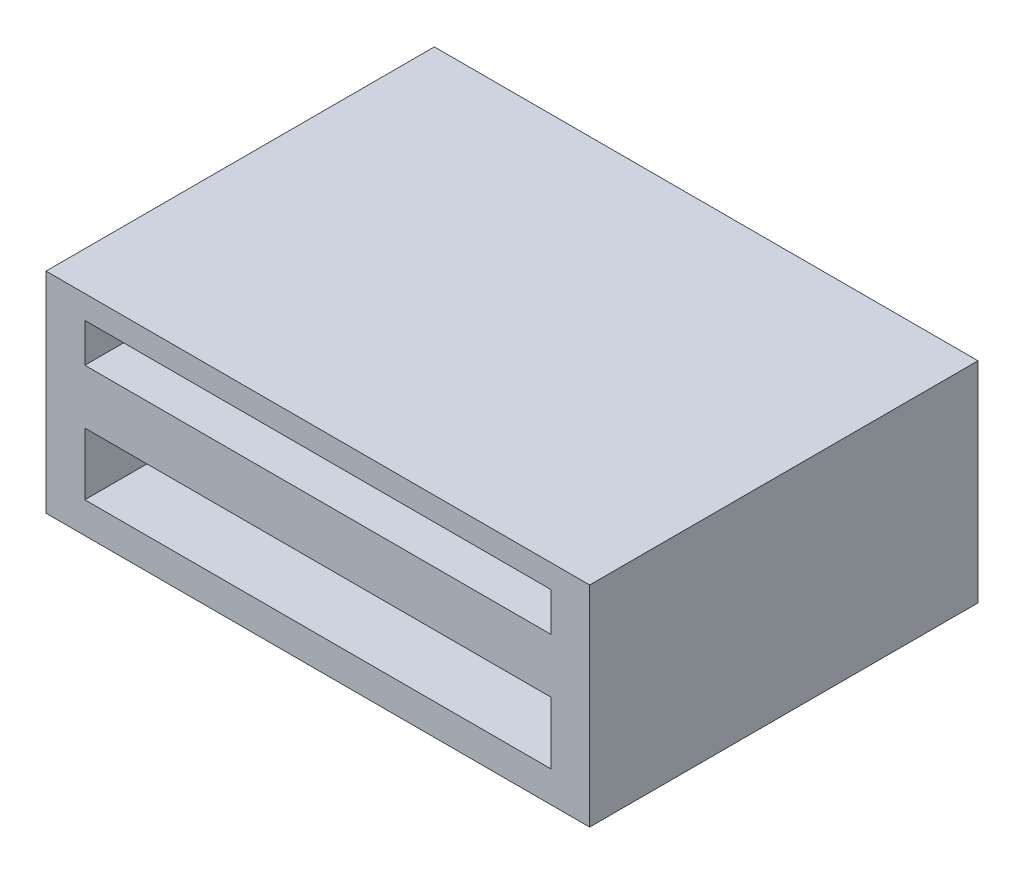
ISO-10303-21;
HEADER;
FILE_DESCRIPTION(('STEP AP214'),'2;1');
FILE_NAME('part.step','',(''),(''),'','','');
FILE_SCHEMA(('AUTOMOTIVE_DESIGN { 1 0 10303 214 1 1 1 1 }'));
ENDSEC;
DATA;
#1=APPLICATION_CONTEXT('core data for automotive mechanical design processes');
#2=APPLICATION_PROTOCOL_DEFINITION('international standard','automotive_design',2000,#1);
#3=PRODUCT_CONTEXT('',#1,'mechanical');
#4=PRODUCT('Part','Part','',(#3));
#5=PRODUCT_RELATED_PRODUCT_CATEGORY('part','',(#4));
#6=PRODUCT_DEFINITION_FORMATION('','',#4);
#7=PRODUCT_DEFINITION_CONTEXT('part definition',#1,'design');
#8=PRODUCT_DEFINITION('design','',#6,#7);
#9=PRODUCT_DEFINITION_SHAPE('','',#8);
#10=(LENGTH_UNIT() NAMED_UNIT(*) SI_UNIT(.MILLI.,.METRE.));
#11=(NAMED_UNIT(*) PLANE_ANGLE_UNIT() SI_UNIT($,.RADIAN.));
#12=(NAMED_UNIT(*) SI_UNIT($,.STERADIAN.) SOLID_ANGLE_UNIT());
#13=UNCERTAINTY_MEASURE_WITH_UNIT(LENGTH_MEASURE(1.E-05),#10,'distance_accuracy_value','');
#14=(GEOMETRIC_REPRESENTATION_CONTEXT(3) GLOBAL_UNCERTAINTY_ASSIGNED_CONTEXT((#13)) GLOBAL_UNIT_ASSIGNED_CONTEXT((#10,
#11,#12)) REPRESENTATION_CONTEXT('',''));
#15=CARTESIAN_POINT('',(0.,0.,0.));
#16=DIRECTION('',(0.,0.,1.));
#17=DIRECTION('',(1.,0.,0.));
#18=AXIS2_PLACEMENT_3D('',#15,#16,#17);
#19=CARTESIAN_POINT('',(0.,0.,50.));
#20=DIRECTION('',(0.,0.,-1.));
#21=DIRECTION('',(-1.,0.,0.));
#22=AXIS2_PLACEMENT_3D('',#19,#20,#21);
#23=PLANE('',#22);
#24=DIRECTION('',(0.,-1.,0.));
#25=VECTOR('',#24,1.);
#26=CARTESIAN_POINT('',(5.,4.,50.));
#27=LINE('',#26,#25);
#28=CARTESIAN_POINT('',(5.,12.,50.));
#29=VERTEX_POINT('',#28);
#30=CARTESIAN_POINT('',(5.,4.,50.));
#31=VERTEX_POINT('',#30);
#32=EDGE_CURVE('E162',#29,#31,#27,.T.);
#33=ORIENTED_EDGE('',*,*,#32,.F.);
#34=DIRECTION('',(-1.,0.,0.));
#35=VECTOR('',#34,1.);
#36=CARTESIAN_POINT('',(5.,12.,50.));
#37=LINE('',#36,#35);
#38=CARTESIAN_POINT('',(65.,12.,50.));
#39=VERTEX_POINT('',#38);
#40=EDGE_CURVE('E170',#39,#29,#37,.T.);
#41=ORIENTED_EDGE('',*,*,#40,.F.);
#42=DIRECTION('',(0.,1.,0.));
#43=VECTOR('',#42,1.);
#44=CARTESIAN_POINT('',(65.,4.,50.));
#45=LINE('',#44,#43);
#46=CARTESIAN_POINT('',(65.,4.,50.));
#47=VERTEX_POINT('',#46);
#48=EDGE_CURVE('E167',#47,#39,#45,.T.);
#49=ORIENTED_EDGE('',*,*,#48,.F.);
#50=DIRECTION('',(1.,0.,0.));
#51=VECTOR('',#50,1.);
#52=CARTESIAN_POINT('',(5.,4.,50.));
#53=LINE('',#52,#51);
#54=EDGE_CURVE('E164',#31,#47,#53,.T.);
#55=ORIENTED_EDGE('',*,*,#54,.F.);
#56=EDGE_LOOP('',(#33,#41,#49,#55));
#57=FACE_BOUND('',#56,.T.);
#58=DIRECTION('',(0.,-1.,0.));
#59=VECTOR('',#58,1.);
#60=CARTESIAN_POINT('',(0.,0.,50.));
#61=LINE('',#60,#59);
#62=CARTESIAN_POINT('',(0.,27.,50.));
#63=VERTEX_POINT('',#62);
#64=CARTESIAN_POINT('',(0.,0.,50.));
#65=VERTEX_POINT('',#64);
#66=EDGE_CURVE('E193',#63,#65,#61,.T.);
#67=ORIENTED_EDGE('',*,*,#66,.T.);
#68=DIRECTION('',(1.,0.,0.));
#69=VECTOR('',#68,1.);
#70=CARTESIAN_POINT('',(0.,0.,50.));
#71=LINE('',#70,#69);
#72=CARTESIAN_POINT('',(70.,0.,50.));
#73=VERTEX_POINT('',#72);
#74=EDGE_CURVE('E196',#65,#73,#71,.T.);
#75=ORIENTED_EDGE('',*,*,#74,.T.);
#76=DIRECTION('',(0.,1.,0.));
#77=VECTOR('',#76,1.);
#78=CARTESIAN_POINT('',(70.,0.,50.));
#79=LINE('',#78,#77);
#80=CARTESIAN_POINT('',(70.,27.,50.));
#81=VERTEX_POINT('',#80);
#82=EDGE_CURVE('E199',#73,#81,#79,.T.);
#83=ORIENTED_EDGE('',*,*,#82,.T.);
#84=DIRECTION('',(-1.,0.,0.));
#85=VECTOR('',#84,1.);
#86=CARTESIAN_POINT('',(0.,27.,50.));
#87=LINE('',#86,#85);
#88=EDGE_CURVE('E201',#81,#63,#87,.T.);
#89=ORIENTED_EDGE('',*,*,#88,.T.);
#90=EDGE_LOOP('',(#67,#75,#83,#89));
#91=FACE_BOUND('',#90,.T.);
#92=DIRECTION('',(0.,-1.,0.));
#93=VECTOR('',#92,1.);
#94=CARTESIAN_POINT('',(5.,19.,50.));
#95=LINE('',#94,#93);
#96=CARTESIAN_POINT('',(5.,24.,50.));
#97=VERTEX_POINT('',#96);
#98=CARTESIAN_POINT('',(5.,19.,50.));
#99=VERTEX_POINT('',#98);
#100=EDGE_CURVE('E126',#97,#99,#95,.T.);
#101=ORIENTED_EDGE('',*,*,#100,.F.);
#102=DIRECTION('',(-1.,0.,0.));
#103=VECTOR('',#102,1.);
#104=CARTESIAN_POINT('',(5.,24.,50.));
#105=LINE('',#104,#103);
#106=CARTESIAN_POINT('',(65.,24.,50.));
#107=VERTEX_POINT('',#106);
#108=EDGE_CURVE('E148',#107,#97,#105,.T.);
#109=ORIENTED_EDGE('',*,*,#108,.F.);
#110=DIRECTION('',(0.,1.,0.));
#111=VECTOR('',#110,1.);
#112=CARTESIAN_POINT('',(65.,19.,50.));
#113=LINE('',#112,#111);
#114=CARTESIAN_POINT('',(65.,19.,50.));
#115=VERTEX_POINT('',#114);
#116=EDGE_CURVE('E146',#115,#107,#113,.T.);
#117=ORIENTED_EDGE('',*,*,#116,.F.);
#118=DIRECTION('',(1.,0.,0.));
#119=VECTOR('',#118,1.);
#120=CARTESIAN_POINT('',(5.,19.,50.));
#121=LINE('',#120,#119);
#122=EDGE_CURVE('E134',#99,#115,#121,.T.);
#123=ORIENTED_EDGE('',*,*,#122,.F.);
#124=EDGE_LOOP('',(#101,#109,#117,#123));
#125=FACE_BOUND('',#124,.T.);
#126=ADVANCED_FACE('F37',(#57,#91,#125),#23,.F.);
#127=CARTESIAN_POINT('',(0.,0.,0.));
#128=DIRECTION('',(0.,0.,-1.));
#129=DIRECTION('',(-1.,0.,0.));
#130=AXIS2_PLACEMENT_3D('',#127,#128,#129);
#131=PLANE('',#130);
#132=DIRECTION('',(-1.,0.,0.));
#133=VECTOR('',#132,1.);
#134=CARTESIAN_POINT('',(5.,12.,0.));
#135=LINE('',#134,#133);
#136=CARTESIAN_POINT('',(65.,12.,0.));
#137=VERTEX_POINT('',#136);
#138=CARTESIAN_POINT('',(5.,12.,0.));
#139=VERTEX_POINT('',#138);
#140=EDGE_CURVE('E165',#137,#139,#135,.T.);
#141=ORIENTED_EDGE('',*,*,#140,.T.);
#142=DIRECTION('',(0.,-1.,0.));
#143=VECTOR('',#142,1.);
#144=CARTESIAN_POINT('',(5.,4.,0.));
#145=LINE('',#144,#143);
#146=CARTESIAN_POINT('',(5.,4.,0.));
#147=VERTEX_POINT('',#146);
#148=EDGE_CURVE('E142',#139,#147,#145,.T.);
#149=ORIENTED_EDGE('',*,*,#148,.T.);
#150=DIRECTION('',(1.,0.,0.));
#151=VECTOR('',#150,1.);
#152=CARTESIAN_POINT('',(5.,4.,0.));
#153=LINE('',#152,#151);
#154=CARTESIAN_POINT('',(65.,4.,0.));
#155=VERTEX_POINT('',#154);
#156=EDGE_CURVE('E175',#147,#155,#153,.T.);
#157=ORIENTED_EDGE('',*,*,#156,.T.);
#158=DIRECTION('',(0.,1.,0.));
#159=VECTOR('',#158,1.);
#160=CARTESIAN_POINT('',(65.,4.,0.));
#161=LINE('',#160,#159);
#162=EDGE_CURVE('E178',#155,#137,#161,.T.);
#163=ORIENTED_EDGE('',*,*,#162,.T.);
#164=EDGE_LOOP('',(#141,#149,#157,#163));
#165=FACE_BOUND('',#164,.T.);
#166=DIRECTION('',(0.,-1.,0.));
#167=VECTOR('',#166,1.);
#168=CARTESIAN_POINT('',(0.,0.,0.));
#169=LINE('',#168,#167);
#170=CARTESIAN_POINT('',(0.,27.,0.));
#171=VERTEX_POINT('',#170);
#172=CARTESIAN_POINT('',(0.,0.,0.));
#173=VERTEX_POINT('',#172);
#174=EDGE_CURVE('E192',#171,#173,#169,.T.);
#175=ORIENTED_EDGE('',*,*,#174,.F.);
#176=DIRECTION('',(-1.,0.,0.));
#177=VECTOR('',#176,1.);
#178=CARTESIAN_POINT('',(0.,27.,0.));
#179=LINE('',#178,#177);
#180=CARTESIAN_POINT('',(70.,27.,0.));
#181=VERTEX_POINT('',#180);
#182=EDGE_CURVE('E197',#181,#171,#179,.T.);
#183=ORIENTED_EDGE('',*,*,#182,.F.);
#184=DIRECTION('',(0.,1.,0.));
#185=VECTOR('',#184,1.);
#186=CARTESIAN_POINT('',(70.,0.,0.));
#187=LINE('',#186,#185);
#188=CARTESIAN_POINT('',(70.,0.,0.));
#189=VERTEX_POINT('',#188);
#190=EDGE_CURVE('E208',#189,#181,#187,.T.);
#191=ORIENTED_EDGE('',*,*,#190,.F.);
#192=DIRECTION('',(1.,0.,0.));
#193=VECTOR('',#192,1.);
#194=CARTESIAN_POINT('',(0.,0.,0.));
#195=LINE('',#194,#193);
#196=EDGE_CURVE('E206',#173,#189,#195,.T.);
#197=ORIENTED_EDGE('',*,*,#196,.F.);
#198=EDGE_LOOP('',(#175,#183,#191,#197));
#199=FACE_BOUND('',#198,.T.);
#200=DIRECTION('',(-1.,0.,0.));
#201=VECTOR('',#200,1.);
#202=CARTESIAN_POINT('',(5.,24.,0.));
#203=LINE('',#202,#201);
#204=CARTESIAN_POINT('',(65.,24.,0.));
#205=VERTEX_POINT('',#204);
#206=CARTESIAN_POINT('',(5.,24.,0.));
#207=VERTEX_POINT('',#206);
#208=EDGE_CURVE('E135',#205,#207,#203,.T.);
#209=ORIENTED_EDGE('',*,*,#208,.T.);
#210=DIRECTION('',(0.,-1.,0.));
#211=VECTOR('',#210,1.);
#212=CARTESIAN_POINT('',(5.,19.,0.));
#213=LINE('',#212,#211);
#214=CARTESIAN_POINT('',(5.,19.,0.));
#215=VERTEX_POINT('',#214);
#216=EDGE_CURVE('E60',#207,#215,#213,.T.);
#217=ORIENTED_EDGE('',*,*,#216,.T.);
#218=DIRECTION('',(1.,0.,0.));
#219=VECTOR('',#218,1.);
#220=CARTESIAN_POINT('',(5.,19.,0.));
#221=LINE('',#220,#219);
#222=CARTESIAN_POINT('',(65.,19.,0.));
#223=VERTEX_POINT('',#222);
#224=EDGE_CURVE('E141',#215,#223,#221,.T.);
#225=ORIENTED_EDGE('',*,*,#224,.T.);
#226=DIRECTION('',(0.,1.,0.));
#227=VECTOR('',#226,1.);
#228=CARTESIAN_POINT('',(65.,19.,0.));
#229=LINE('',#228,#227);
#230=EDGE_CURVE('E154',#223,#205,#229,.T.);
#231=ORIENTED_EDGE('',*,*,#230,.T.);
#232=EDGE_LOOP('',(#209,#217,#225,#231));
#233=FACE_BOUND('',#232,.T.);
#234=ADVANCED_FACE('F226',(#165,#199,#233),#131,.T.);
#235=CARTESIAN_POINT('',(0.,0.,50.));
#236=DIRECTION('',(1.,0.,0.));
#237=DIRECTION('',(0.,0.,-1.));
#238=AXIS2_PLACEMENT_3D('',#235,#236,#237);
#239=PLANE('',#238);
#240=ORIENTED_EDGE('',*,*,#174,.T.);
#241=DIRECTION('',(0.,0.,-1.));
#242=VECTOR('',#241,1.);
#243=CARTESIAN_POINT('',(0.,0.,50.));
#244=LINE('',#243,#242);
#245=EDGE_CURVE('E11',#65,#173,#244,.T.);
#246=ORIENTED_EDGE('',*,*,#245,.F.);
#247=ORIENTED_EDGE('',*,*,#66,.F.);
#248=DIRECTION('',(0.,0.,-1.));
#249=VECTOR('',#248,1.);
#250=CARTESIAN_POINT('',(0.,27.,50.));
#251=LINE('',#250,#249);
#252=EDGE_CURVE('E203',#63,#171,#251,.T.);
#253=ORIENTED_EDGE('',*,*,#252,.T.);
#254=EDGE_LOOP('',(#240,#246,#247,#253));
#255=FACE_BOUND('',#254,.T.);
#256=ADVANCED_FACE('F39',(#255),#239,.F.);
#257=CARTESIAN_POINT('',(0.,0.,50.));
#258=DIRECTION('',(0.,1.,0.));
#259=DIRECTION('',(0.,0.,1.));
#260=AXIS2_PLACEMENT_3D('',#257,#258,#259);
#261=PLANE('',#260);
#262=ORIENTED_EDGE('',*,*,#196,.T.);
#263=DIRECTION('',(0.,0.,-1.));
#264=VECTOR('',#263,1.);
#265=CARTESIAN_POINT('',(70.,0.,50.));
#266=LINE('',#265,#264);
#267=EDGE_CURVE('E45',#73,#189,#266,.T.);
#268=ORIENTED_EDGE('',*,*,#267,.F.);
#269=ORIENTED_EDGE('',*,*,#74,.F.);
#270=ORIENTED_EDGE('',*,*,#245,.T.);
#271=EDGE_LOOP('',(#262,#268,#269,#270));
#272=FACE_BOUND('',#271,.T.);
#273=ADVANCED_FACE('F236',(#272),#261,.F.);
#274=CARTESIAN_POINT('',(70.,0.,50.));
#275=DIRECTION('',(-1.,0.,0.));
#276=DIRECTION('',(0.,0.,1.));
#277=AXIS2_PLACEMENT_3D('',#274,#275,#276);
#278=PLANE('',#277);
#279=ORIENTED_EDGE('',*,*,#190,.T.);
#280=DIRECTION('',(0.,0.,-1.));
#281=VECTOR('',#280,1.);
#282=CARTESIAN_POINT('',(70.,27.,50.));
#283=LINE('',#282,#281);
#284=EDGE_CURVE('E213',#81,#181,#283,.T.);
#285=ORIENTED_EDGE('',*,*,#284,.F.);
#286=ORIENTED_EDGE('',*,*,#82,.F.);
#287=ORIENTED_EDGE('',*,*,#267,.T.);
#288=EDGE_LOOP('',(#279,#285,#286,#287));
#289=FACE_BOUND('',#288,.T.);
#290=ADVANCED_FACE('F220',(#289),#278,.F.);
#291=CARTESIAN_POINT('',(0.,27.,50.));
#292=DIRECTION('',(0.,-1.,0.));
#293=DIRECTION('',(0.,0.,-1.));
#294=AXIS2_PLACEMENT_3D('',#291,#292,#293);
#295=PLANE('',#294);
#296=ORIENTED_EDGE('',*,*,#182,.T.);
#297=ORIENTED_EDGE('',*,*,#252,.F.);
#298=ORIENTED_EDGE('',*,*,#88,.F.);
#299=ORIENTED_EDGE('',*,*,#284,.T.);
#300=EDGE_LOOP('',(#296,#297,#298,#299));
#301=FACE_BOUND('',#300,.T.);
#302=ADVANCED_FACE('F230',(#301),#295,.F.);
#303=CARTESIAN_POINT('',(5.,4.,50.));
#304=DIRECTION('',(1.,0.,0.));
#305=DIRECTION('',(0.,0.,-1.));
#306=AXIS2_PLACEMENT_3D('',#303,#304,#305);
#307=PLANE('',#306);
#308=ORIENTED_EDGE('',*,*,#148,.F.);
#309=DIRECTION('',(0.,0.,-1.));
#310=VECTOR('',#309,1.);
#311=CARTESIAN_POINT('',(5.,12.,50.));
#312=LINE('',#311,#310);
#313=EDGE_CURVE('E172',#29,#139,#312,.T.);
#314=ORIENTED_EDGE('',*,*,#313,.F.);
#315=ORIENTED_EDGE('',*,*,#32,.T.);
#316=DIRECTION('',(0.,0.,-1.));
#317=VECTOR('',#316,1.);
#318=CARTESIAN_POINT('',(5.,4.,50.));
#319=LINE('',#318,#317);
#320=EDGE_CURVE('E189',#31,#147,#319,.T.);
#321=ORIENTED_EDGE('',*,*,#320,.T.);
#322=EDGE_LOOP('',(#308,#314,#315,#321));
#323=FACE_BOUND('',#322,.T.);
#324=ADVANCED_FACE('F253',(#323),#307,.T.);
#325=CARTESIAN_POINT('',(5.,4.,50.));
#326=DIRECTION('',(0.,1.,0.));
#327=DIRECTION('',(0.,0.,1.));
#328=AXIS2_PLACEMENT_3D('',#325,#326,#327);
#329=PLANE('',#328);
#330=ORIENTED_EDGE('',*,*,#156,.F.);
#331=ORIENTED_EDGE('',*,*,#320,.F.);
#332=ORIENTED_EDGE('',*,*,#54,.T.);
#333=DIRECTION('',(0.,0.,-1.));
#334=VECTOR('',#333,1.);
#335=CARTESIAN_POINT('',(65.,4.,50.));
#336=LINE('',#335,#334);
#337=EDGE_CURVE('E187',#47,#155,#336,.T.);
#338=ORIENTED_EDGE('',*,*,#337,.T.);
#339=EDGE_LOOP('',(#330,#331,#332,#338));
#340=FACE_BOUND('',#339,.T.);
#341=ADVANCED_FACE('F260',(#340),#329,.T.);
#342=CARTESIAN_POINT('',(65.,4.,50.));
#343=DIRECTION('',(-1.,0.,0.));
#344=DIRECTION('',(0.,0.,1.));
#345=AXIS2_PLACEMENT_3D('',#342,#343,#344);
#346=PLANE('',#345);
#347=ORIENTED_EDGE('',*,*,#162,.F.);
#348=ORIENTED_EDGE('',*,*,#337,.F.);
#349=ORIENTED_EDGE('',*,*,#48,.T.);
#350=DIRECTION('',(0.,0.,-1.));
#351=VECTOR('',#350,1.);
#352=CARTESIAN_POINT('',(65.,12.,50.));
#353=LINE('',#352,#351);
#354=EDGE_CURVE('E185',#39,#137,#353,.T.);
#355=ORIENTED_EDGE('',*,*,#354,.T.);
#356=EDGE_LOOP('',(#347,#348,#349,#355));
#357=FACE_BOUND('',#356,.T.);
#358=ADVANCED_FACE('F265',(#357),#346,.T.);
#359=CARTESIAN_POINT('',(5.,12.,50.));
#360=DIRECTION('',(0.,-1.,0.));
#361=DIRECTION('',(0.,0.,-1.));
#362=AXIS2_PLACEMENT_3D('',#359,#360,#361);
#363=PLANE('',#362);
#364=ORIENTED_EDGE('',*,*,#140,.F.);
#365=ORIENTED_EDGE('',*,*,#354,.F.);
#366=ORIENTED_EDGE('',*,*,#40,.T.);
#367=ORIENTED_EDGE('',*,*,#313,.T.);
#368=EDGE_LOOP('',(#364,#365,#366,#367));
#369=FACE_BOUND('',#368,.T.);
#370=ADVANCED_FACE('F271',(#369),#363,.T.);
#371=CARTESIAN_POINT('',(5.,19.,50.));
#372=DIRECTION('',(1.,0.,0.));
#373=DIRECTION('',(0.,0.,-1.));
#374=AXIS2_PLACEMENT_3D('',#371,#372,#373);
#375=PLANE('',#374);
#376=ORIENTED_EDGE('',*,*,#216,.F.);
#377=DIRECTION('',(0.,0.,-1.));
#378=VECTOR('',#377,1.);
#379=CARTESIAN_POINT('',(5.,24.,50.));
#380=LINE('',#379,#378);
#381=EDGE_CURVE('E130',#97,#207,#380,.T.);
#382=ORIENTED_EDGE('',*,*,#381,.F.);
#383=ORIENTED_EDGE('',*,*,#100,.T.);
#384=DIRECTION('',(0.,0.,-1.));
#385=VECTOR('',#384,1.);
#386=CARTESIAN_POINT('',(5.,19.,50.));
#387=LINE('',#386,#385);
#388=EDGE_CURVE('E129',#99,#215,#387,.T.);
#389=ORIENTED_EDGE('',*,*,#388,.T.);
#390=EDGE_LOOP('',(#376,#382,#383,#389));
#391=FACE_BOUND('',#390,.T.);
#392=ADVANCED_FACE('F128',(#391),#375,.T.);
#393=CARTESIAN_POINT('',(5.,19.,50.));
#394=DIRECTION('',(0.,1.,0.));
#395=DIRECTION('',(0.,0.,1.));
#396=AXIS2_PLACEMENT_3D('',#393,#394,#395);
#397=PLANE('',#396);
#398=ORIENTED_EDGE('',*,*,#224,.F.);
#399=ORIENTED_EDGE('',*,*,#388,.F.);
#400=ORIENTED_EDGE('',*,*,#122,.T.);
#401=DIRECTION('',(0.,0.,-1.));
#402=VECTOR('',#401,1.);
#403=CARTESIAN_POINT('',(65.,19.,50.));
#404=LINE('',#403,#402);
#405=EDGE_CURVE('E143',#115,#223,#404,.T.);
#406=ORIENTED_EDGE('',*,*,#405,.T.);
#407=EDGE_LOOP('',(#398,#399,#400,#406));
#408=FACE_BOUND('',#407,.T.);
#409=ADVANCED_FACE('F138',(#408),#397,.T.);
#410=CARTESIAN_POINT('',(65.,19.,50.));
#411=DIRECTION('',(-1.,0.,0.));
#412=DIRECTION('',(0.,0.,1.));
#413=AXIS2_PLACEMENT_3D('',#410,#411,#412);
#414=PLANE('',#413);
#415=ORIENTED_EDGE('',*,*,#230,.F.);
#416=ORIENTED_EDGE('',*,*,#405,.F.);
#417=ORIENTED_EDGE('',*,*,#116,.T.);
#418=DIRECTION('',(0.,0.,-1.));
#419=VECTOR('',#418,1.);
#420=CARTESIAN_POINT('',(65.,24.,50.));
#421=LINE('',#420,#419);
#422=EDGE_CURVE('E52',#107,#205,#421,.T.);
#423=ORIENTED_EDGE('',*,*,#422,.T.);
#424=EDGE_LOOP('',(#415,#416,#417,#423));
#425=FACE_BOUND('',#424,.T.);
#426=ADVANCED_FACE('F289',(#425),#414,.T.);
#427=CARTESIAN_POINT('',(5.,24.,50.));
#428=DIRECTION('',(0.,-1.,0.));
#429=DIRECTION('',(0.,0.,-1.));
#430=AXIS2_PLACEMENT_3D('',#427,#428,#429);
#431=PLANE('',#430);
#432=ORIENTED_EDGE('',*,*,#208,.F.);
#433=ORIENTED_EDGE('',*,*,#422,.F.);
#434=ORIENTED_EDGE('',*,*,#108,.T.);
#435=ORIENTED_EDGE('',*,*,#381,.T.);
#436=EDGE_LOOP('',(#432,#433,#434,#435));
#437=FACE_BOUND('',#436,.T.);
#438=ADVANCED_FACE('F292',(#437),#431,.T.);
#439=CLOSED_SHELL('',(#126,#234,#256,#273,#290,#302,#324,#341,#358,#370,#392,#409,#426,#438));
#440=MANIFOLD_SOLID_BREP('B2',#439);
#441=ADVANCED_BREP_SHAPE_REPRESENTATION('',(#18,#440),#14);
#442=SHAPE_DEFINITION_REPRESENTATION(#9,#441);
ENDSEC;
END-ISO-10303-21;
